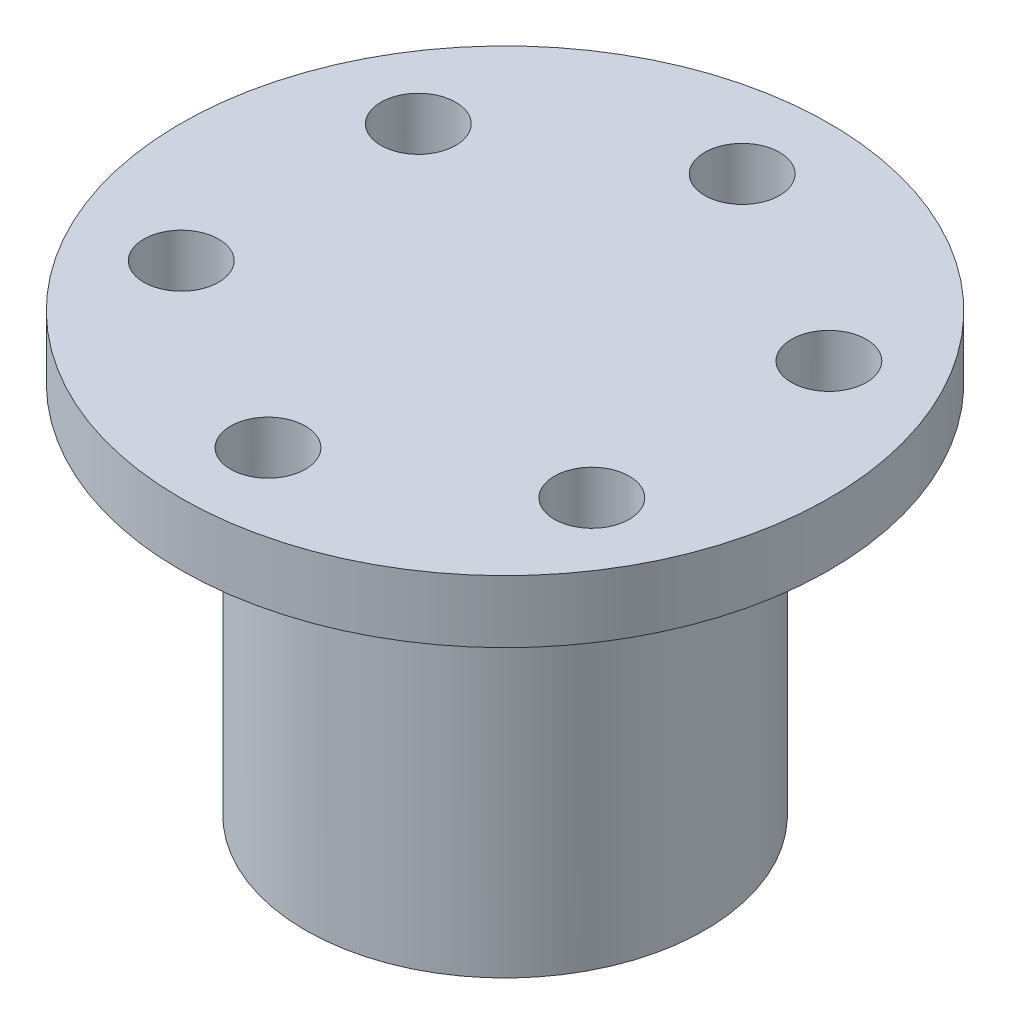
ISO-10303-21;
HEADER;
FILE_DESCRIPTION(('STEP AP214'),'2;1');
FILE_NAME('part.step','',(''),(''),'','','');
FILE_SCHEMA(('AUTOMOTIVE_DESIGN { 1 0 10303 214 1 1 1 1 }'));
ENDSEC;
DATA;
#1=APPLICATION_CONTEXT('core data for automotive mechanical design processes');
#2=APPLICATION_PROTOCOL_DEFINITION('international standard','automotive_design',2000,#1);
#3=PRODUCT_CONTEXT('',#1,'mechanical');
#4=PRODUCT('Part','Part','',(#3));
#5=PRODUCT_RELATED_PRODUCT_CATEGORY('part','',(#4));
#6=PRODUCT_DEFINITION_FORMATION('','',#4);
#7=PRODUCT_DEFINITION_CONTEXT('part definition',#1,'design');
#8=PRODUCT_DEFINITION('design','',#6,#7);
#9=PRODUCT_DEFINITION_SHAPE('','',#8);
#10=(LENGTH_UNIT() NAMED_UNIT(*) SI_UNIT(.MILLI.,.METRE.));
#11=(NAMED_UNIT(*) PLANE_ANGLE_UNIT() SI_UNIT($,.RADIAN.));
#12=(NAMED_UNIT(*) SI_UNIT($,.STERADIAN.) SOLID_ANGLE_UNIT());
#13=UNCERTAINTY_MEASURE_WITH_UNIT(LENGTH_MEASURE(1.E-05),#10,'distance_accuracy_value','');
#14=(GEOMETRIC_REPRESENTATION_CONTEXT(3) GLOBAL_UNCERTAINTY_ASSIGNED_CONTEXT((#13)) GLOBAL_UNIT_ASSIGNED_CONTEXT((#10,
#11,#12)) REPRESENTATION_CONTEXT('',''));
#15=CARTESIAN_POINT('',(0.,0.,0.));
#16=DIRECTION('',(0.,0.,1.));
#17=DIRECTION('',(1.,0.,0.));
#18=AXIS2_PLACEMENT_3D('',#15,#16,#17);
#19=CARTESIAN_POINT('',(0.,5.,0.));
#20=DIRECTION('',(0.,-1.,0.));
#21=DIRECTION('',(0.,0.,-1.));
#22=AXIS2_PLACEMENT_3D('',#19,#20,#21);
#23=CYLINDRICAL_SURFACE('',#22,26.);
#24=CARTESIAN_POINT('',(0.,5.,0.));
#25=DIRECTION('',(0.,1.,0.));
#26=DIRECTION('',(0.,0.,1.));
#27=AXIS2_PLACEMENT_3D('',#24,#25,#26);
#28=CIRCLE('',#27,26.);
#29=CARTESIAN_POINT('',(0.,5.,26.));
#30=VERTEX_POINT('',#29);
#31=EDGE_CURVE('E209',#30,#30,#28,.T.);
#32=ORIENTED_EDGE('',*,*,#31,.F.);
#33=EDGE_LOOP('',(#32));
#34=FACE_BOUND('',#33,.T.);
#35=CARTESIAN_POINT('',(0.,0.,0.));
#36=DIRECTION('',(0.,1.,0.));
#37=DIRECTION('',(0.,0.,1.));
#38=AXIS2_PLACEMENT_3D('',#35,#36,#37);
#39=CIRCLE('',#38,26.);
#40=CARTESIAN_POINT('',(0.,0.,26.));
#41=VERTEX_POINT('',#40);
#42=EDGE_CURVE('E48',#41,#41,#39,.T.);
#43=ORIENTED_EDGE('',*,*,#42,.T.);
#44=EDGE_LOOP('',(#43));
#45=FACE_BOUND('',#44,.T.);
#46=ADVANCED_FACE('F45',(#34,#45),#23,.T.);
#47=CARTESIAN_POINT('',(0.,5.,0.));
#48=DIRECTION('',(0.,1.,0.));
#49=DIRECTION('',(0.,0.,1.));
#50=AXIS2_PLACEMENT_3D('',#47,#48,#49);
#51=PLANE('',#50);
#52=CARTESIAN_POINT('',(1.40512601554121E-12,5.,18.9999999999991));
#53=DIRECTION('',(0.,1.,0.));
#54=DIRECTION('',(0.,0.,1.));
#55=AXIS2_PLACEMENT_3D('',#52,#53,#54);
#56=CIRCLE('',#55,3.);
#57=CARTESIAN_POINT('',(1.40512601554121E-12,5.,21.9999999999991));
#58=VERTEX_POINT('',#57);
#59=EDGE_CURVE('E196',#58,#58,#56,.T.);
#60=ORIENTED_EDGE('',*,*,#59,.F.);
#61=EDGE_LOOP('',(#60));
#62=FACE_BOUND('',#61,.T.);
#63=CARTESIAN_POINT('',(16.4544826719043,5.,9.49999999999828));
#64=DIRECTION('',(0.,1.,0.));
#65=DIRECTION('',(0.,0.,1.));
#66=AXIS2_PLACEMENT_3D('',#63,#64,#65);
#67=CIRCLE('',#66,3.);
#68=CARTESIAN_POINT('',(16.4544826719043,5.,12.4999999999983));
#69=VERTEX_POINT('',#68);
#70=EDGE_CURVE('E188',#69,#69,#67,.T.);
#71=ORIENTED_EDGE('',*,*,#70,.F.);
#72=EDGE_LOOP('',(#71));
#73=FACE_BOUND('',#72,.T.);
#74=CARTESIAN_POINT('',(16.4544826719028,5.,-9.50000000000083));
#75=DIRECTION('',(0.,1.,0.));
#76=DIRECTION('',(0.,0.,1.));
#77=AXIS2_PLACEMENT_3D('',#74,#75,#76);
#78=CIRCLE('',#77,3.);
#79=CARTESIAN_POINT('',(16.4544826719028,5.,-6.50000000000082));
#80=VERTEX_POINT('',#79);
#81=EDGE_CURVE('E180',#80,#80,#78,.T.);
#82=ORIENTED_EDGE('',*,*,#81,.F.);
#83=EDGE_LOOP('',(#82));
#84=FACE_BOUND('',#83,.T.);
#85=CARTESIAN_POINT('',(-1.53523027623947E-12,5.,-18.9999999999991));
#86=DIRECTION('',(0.,1.,0.));
#87=DIRECTION('',(0.,0.,1.));
#88=AXIS2_PLACEMENT_3D('',#85,#86,#87);
#89=CIRCLE('',#88,3.);
#90=CARTESIAN_POINT('',(-1.53523027623947E-12,5.,-15.9999999999991));
#91=VERTEX_POINT('',#90);
#92=EDGE_CURVE('E172',#91,#91,#89,.T.);
#93=ORIENTED_EDGE('',*,*,#92,.F.);
#94=EDGE_LOOP('',(#93));
#95=FACE_BOUND('',#94,.T.);
#96=CARTESIAN_POINT('',(-16.4544826719043,5.,-9.49999999999817));
#97=DIRECTION('',(0.,1.,0.));
#98=DIRECTION('',(0.,0.,1.));
#99=AXIS2_PLACEMENT_3D('',#96,#97,#98);
#100=CIRCLE('',#99,3.);
#101=CARTESIAN_POINT('',(-16.4544826719043,5.,-6.49999999999817));
#102=VERTEX_POINT('',#101);
#103=EDGE_CURVE('E163',#102,#102,#100,.T.);
#104=ORIENTED_EDGE('',*,*,#103,.F.);
#105=EDGE_LOOP('',(#104));
#106=FACE_BOUND('',#105,.T.);
#107=CARTESIAN_POINT('',(-16.4544826719027,5.,9.50000000000094));
#108=DIRECTION('',(0.,1.,0.));
#109=DIRECTION('',(0.,0.,1.));
#110=AXIS2_PLACEMENT_3D('',#107,#108,#109);
#111=CIRCLE('',#110,3.);
#112=CARTESIAN_POINT('',(-16.4544826719027,5.,12.5000000000009));
#113=VERTEX_POINT('',#112);
#114=EDGE_CURVE('E167',#113,#113,#111,.T.);
#115=ORIENTED_EDGE('',*,*,#114,.F.);
#116=EDGE_LOOP('',(#115));
#117=FACE_BOUND('',#116,.T.);
#118=ORIENTED_EDGE('',*,*,#31,.T.);
#119=EDGE_LOOP('',(#118));
#120=FACE_BOUND('',#119,.T.);
#121=ADVANCED_FACE('F224',(#62,#73,#84,#95,#106,#117,#120),#51,.T.);
#122=CARTESIAN_POINT('',(0.,0.,0.));
#123=DIRECTION('',(0.,1.,0.));
#124=DIRECTION('',(0.,0.,1.));
#125=AXIS2_PLACEMENT_3D('',#122,#123,#124);
#126=PLANE('',#125);
#127=CARTESIAN_POINT('',(1.40512601554121E-12,0.,18.9999999999991));
#128=DIRECTION('',(0.,1.,0.));
#129=DIRECTION('',(0.,0.,1.));
#130=AXIS2_PLACEMENT_3D('',#127,#128,#129);
#131=CIRCLE('',#130,3.);
#132=CARTESIAN_POINT('',(1.18326401308734E-12,0.,15.9999999999992));
#133=VERTEX_POINT('',#132);
#134=EDGE_CURVE('E159',#133,#133,#131,.T.);
#135=ORIENTED_EDGE('',*,*,#134,.T.);
#136=CARTESIAN_POINT('',(0.,0.,0.));
#137=DIRECTION('',(0.,1.,0.));
#138=DIRECTION('',(0.,0.,1.));
#139=AXIS2_PLACEMENT_3D('',#136,#137,#138);
#140=CIRCLE('',#139,16.);
#141=CARTESIAN_POINT('',(13.8564064605516,0.,7.99999999999894));
#142=VERTEX_POINT('',#141);
#143=EDGE_CURVE('E56',#133,#142,#140,.T.);
#144=ORIENTED_EDGE('',*,*,#143,.T.);
#145=CARTESIAN_POINT('',(16.4544826719043,0.,9.49999999999828));
#146=DIRECTION('',(0.,1.,0.));
#147=DIRECTION('',(0.,0.,1.));
#148=AXIS2_PLACEMENT_3D('',#145,#146,#147);
#149=CIRCLE('',#148,3.);
#150=EDGE_CURVE('E192',#142,#142,#149,.T.);
#151=ORIENTED_EDGE('',*,*,#150,.T.);
#152=CARTESIAN_POINT('',(13.8564064605504,0.,-8.00000000000108));
#153=VERTEX_POINT('',#152);
#154=EDGE_CURVE('E11',#142,#153,#140,.T.);
#155=ORIENTED_EDGE('',*,*,#154,.T.);
#156=CARTESIAN_POINT('',(16.4544826719028,0.,-9.50000000000083));
#157=DIRECTION('',(0.,1.,0.));
#158=DIRECTION('',(0.,0.,1.));
#159=AXIS2_PLACEMENT_3D('',#156,#157,#158);
#160=CIRCLE('',#159,3.);
#161=EDGE_CURVE('E184',#153,#153,#160,.T.);
#162=ORIENTED_EDGE('',*,*,#161,.T.);
#163=CARTESIAN_POINT('',(-1.29282549578067E-12,0.,-16.));
#164=VERTEX_POINT('',#163);
#165=EDGE_CURVE('E54',#153,#164,#140,.T.);
#166=ORIENTED_EDGE('',*,*,#165,.T.);
#167=CARTESIAN_POINT('',(-1.53523027623947E-12,0.,-18.9999999999991));
#168=DIRECTION('',(0.,1.,0.));
#169=DIRECTION('',(0.,0.,1.));
#170=AXIS2_PLACEMENT_3D('',#167,#168,#169);
#171=CIRCLE('',#170,3.);
#172=EDGE_CURVE('E176',#164,#164,#171,.T.);
#173=ORIENTED_EDGE('',*,*,#172,.T.);
#174=CARTESIAN_POINT('',(-13.8564064605517,0.,-7.99999999999885));
#175=VERTEX_POINT('',#174);
#176=EDGE_CURVE('E431',#164,#175,#140,.T.);
#177=ORIENTED_EDGE('',*,*,#176,.T.);
#178=CARTESIAN_POINT('',(-16.4544826719043,0.,-9.49999999999817));
#179=DIRECTION('',(0.,1.,0.));
#180=DIRECTION('',(0.,0.,1.));
#181=AXIS2_PLACEMENT_3D('',#178,#179,#180);
#182=CIRCLE('',#181,3.);
#183=EDGE_CURVE('E168',#175,#175,#182,.T.);
#184=ORIENTED_EDGE('',*,*,#183,.T.);
#185=CARTESIAN_POINT('',(-13.8564064605503,0.,8.00000000000118));
#186=VERTEX_POINT('',#185);
#187=EDGE_CURVE('E216',#175,#186,#140,.T.);
#188=ORIENTED_EDGE('',*,*,#187,.T.);
#189=CARTESIAN_POINT('',(-16.4544826719027,0.,9.50000000000094));
#190=DIRECTION('',(0.,1.,0.));
#191=DIRECTION('',(0.,0.,1.));
#192=AXIS2_PLACEMENT_3D('',#189,#190,#191);
#193=CIRCLE('',#192,3.);
#194=EDGE_CURVE('E203',#186,#186,#193,.T.);
#195=ORIENTED_EDGE('',*,*,#194,.T.);
#196=EDGE_CURVE('E162',#186,#133,#140,.T.);
#197=ORIENTED_EDGE('',*,*,#196,.T.);
#198=EDGE_LOOP('',(#135,#144,#151,#155,#162,#166,#173,#177,#184,#188,#195,#197));
#199=FACE_BOUND('',#198,.T.);
#200=ORIENTED_EDGE('',*,*,#42,.F.);
#201=EDGE_LOOP('',(#200));
#202=FACE_BOUND('',#201,.T.);
#203=ADVANCED_FACE('F221',(#199,#202),#126,.F.);
#204=CARTESIAN_POINT('',(-16.4544826719027,0.,9.50000000000094));
#205=DIRECTION('',(0.,1.,0.));
#206=DIRECTION('',(0.,0.,1.));
#207=AXIS2_PLACEMENT_3D('',#204,#205,#206);
#208=CYLINDRICAL_SURFACE('',#207,3.);
#209=ORIENTED_EDGE('',*,*,#194,.F.);
#210=EDGE_LOOP('',(#209));
#211=FACE_BOUND('',#210,.T.);
#212=ORIENTED_EDGE('',*,*,#114,.T.);
#213=EDGE_LOOP('',(#212));
#214=FACE_BOUND('',#213,.T.);
#215=ADVANCED_FACE('F223',(#211,#214),#208,.F.);
#216=CARTESIAN_POINT('',(-16.4544826719043,0.,-9.49999999999817));
#217=DIRECTION('',(0.,1.,0.));
#218=DIRECTION('',(0.,0.,1.));
#219=AXIS2_PLACEMENT_3D('',#216,#217,#218);
#220=CYLINDRICAL_SURFACE('',#219,3.);
#221=ORIENTED_EDGE('',*,*,#183,.F.);
#222=EDGE_LOOP('',(#221));
#223=FACE_BOUND('',#222,.T.);
#224=ORIENTED_EDGE('',*,*,#103,.T.);
#225=EDGE_LOOP('',(#224));
#226=FACE_BOUND('',#225,.T.);
#227=ADVANCED_FACE('F230',(#223,#226),#220,.F.);
#228=CARTESIAN_POINT('',(-1.53523027623947E-12,0.,-18.9999999999991));
#229=DIRECTION('',(0.,1.,0.));
#230=DIRECTION('',(0.,0.,1.));
#231=AXIS2_PLACEMENT_3D('',#228,#229,#230);
#232=CYLINDRICAL_SURFACE('',#231,3.);
#233=ORIENTED_EDGE('',*,*,#172,.F.);
#234=EDGE_LOOP('',(#233));
#235=FACE_BOUND('',#234,.T.);
#236=ORIENTED_EDGE('',*,*,#92,.T.);
#237=EDGE_LOOP('',(#236));
#238=FACE_BOUND('',#237,.T.);
#239=ADVANCED_FACE('F265',(#235,#238),#232,.F.);
#240=CARTESIAN_POINT('',(16.4544826719028,0.,-9.50000000000083));
#241=DIRECTION('',(0.,1.,0.));
#242=DIRECTION('',(0.,0.,1.));
#243=AXIS2_PLACEMENT_3D('',#240,#241,#242);
#244=CYLINDRICAL_SURFACE('',#243,3.);
#245=ORIENTED_EDGE('',*,*,#161,.F.);
#246=EDGE_LOOP('',(#245));
#247=FACE_BOUND('',#246,.T.);
#248=ORIENTED_EDGE('',*,*,#81,.T.);
#249=EDGE_LOOP('',(#248));
#250=FACE_BOUND('',#249,.T.);
#251=ADVANCED_FACE('F276',(#247,#250),#244,.F.);
#252=CARTESIAN_POINT('',(16.4544826719043,0.,9.49999999999828));
#253=DIRECTION('',(0.,1.,0.));
#254=DIRECTION('',(0.,0.,1.));
#255=AXIS2_PLACEMENT_3D('',#252,#253,#254);
#256=CYLINDRICAL_SURFACE('',#255,3.);
#257=ORIENTED_EDGE('',*,*,#150,.F.);
#258=EDGE_LOOP('',(#257));
#259=FACE_BOUND('',#258,.T.);
#260=ORIENTED_EDGE('',*,*,#70,.T.);
#261=EDGE_LOOP('',(#260));
#262=FACE_BOUND('',#261,.T.);
#263=ADVANCED_FACE('F287',(#259,#262),#256,.F.);
#264=CARTESIAN_POINT('',(1.40512601554121E-12,0.,18.9999999999991));
#265=DIRECTION('',(0.,1.,0.));
#266=DIRECTION('',(0.,0.,1.));
#267=AXIS2_PLACEMENT_3D('',#264,#265,#266);
#268=CYLINDRICAL_SURFACE('',#267,3.);
#269=ORIENTED_EDGE('',*,*,#134,.F.);
#270=EDGE_LOOP('',(#269));
#271=FACE_BOUND('',#270,.T.);
#272=ORIENTED_EDGE('',*,*,#59,.T.);
#273=EDGE_LOOP('',(#272));
#274=FACE_BOUND('',#273,.T.);
#275=ADVANCED_FACE('F298',(#271,#274),#268,.F.);
#276=CARTESIAN_POINT('',(0.,-30.,0.));
#277=DIRECTION('',(0.,1.,0.));
#278=DIRECTION('',(0.,0.,1.));
#279=AXIS2_PLACEMENT_3D('',#276,#277,#278);
#280=CYLINDRICAL_SURFACE('',#279,16.);
#281=CARTESIAN_POINT('',(0.,-30.,0.));
#282=DIRECTION('',(0.,1.,0.));
#283=DIRECTION('',(0.,0.,1.));
#284=AXIS2_PLACEMENT_3D('',#281,#282,#283);
#285=CIRCLE('',#284,16.);
#286=CARTESIAN_POINT('',(0.,-30.,16.));
#287=VERTEX_POINT('',#286);
#288=EDGE_CURVE('E156',#287,#287,#285,.T.);
#289=ORIENTED_EDGE('',*,*,#288,.T.);
#290=EDGE_LOOP('',(#289));
#291=FACE_BOUND('',#290,.T.);
#292=ORIENTED_EDGE('',*,*,#143,.F.);
#293=ORIENTED_EDGE('',*,*,#196,.F.);
#294=ORIENTED_EDGE('',*,*,#187,.F.);
#295=ORIENTED_EDGE('',*,*,#176,.F.);
#296=ORIENTED_EDGE('',*,*,#165,.F.);
#297=ORIENTED_EDGE('',*,*,#154,.F.);
#298=EDGE_LOOP('',(#292,#293,#294,#295,#296,#297));
#299=FACE_BOUND('',#298,.T.);
#300=ADVANCED_FACE('F309',(#291,#299),#280,.T.);
#301=CARTESIAN_POINT('',(0.,-30.,0.));
#302=DIRECTION('',(0.,1.,0.));
#303=DIRECTION('',(0.,0.,1.));
#304=AXIS2_PLACEMENT_3D('',#301,#302,#303);
#305=PLANE('',#304);
#306=DIRECTION('',(-1.,0.,0.));
#307=VECTOR('',#306,1.);
#308=CARTESIAN_POINT('',(-9.,-30.,9.));
#309=LINE('',#308,#307);
#310=CARTESIAN_POINT('',(9.,-30.,9.));
#311=VERTEX_POINT('',#310);
#312=CARTESIAN_POINT('',(-9.,-30.,9.));
#313=VERTEX_POINT('',#312);
#314=EDGE_CURVE('E142',#311,#313,#309,.T.);
#315=ORIENTED_EDGE('',*,*,#314,.F.);
#316=DIRECTION('',(0.,0.,1.));
#317=VECTOR('',#316,1.);
#318=CARTESIAN_POINT('',(9.,-30.,-9.));
#319=LINE('',#318,#317);
#320=CARTESIAN_POINT('',(9.,-30.,-9.));
#321=VERTEX_POINT('',#320);
#322=EDGE_CURVE('E63',#321,#311,#319,.T.);
#323=ORIENTED_EDGE('',*,*,#322,.F.);
#324=DIRECTION('',(1.,0.,0.));
#325=VECTOR('',#324,1.);
#326=CARTESIAN_POINT('',(-9.,-30.,-9.));
#327=LINE('',#326,#325);
#328=CARTESIAN_POINT('',(-9.,-30.,-9.));
#329=VERTEX_POINT('',#328);
#330=EDGE_CURVE('E129',#329,#321,#327,.T.);
#331=ORIENTED_EDGE('',*,*,#330,.F.);
#332=DIRECTION('',(0.,0.,-1.));
#333=VECTOR('',#332,1.);
#334=CARTESIAN_POINT('',(-9.,-30.,-9.));
#335=LINE('',#334,#333);
#336=EDGE_CURVE('E133',#313,#329,#335,.T.);
#337=ORIENTED_EDGE('',*,*,#336,.F.);
#338=EDGE_LOOP('',(#315,#323,#331,#337));
#339=FACE_BOUND('',#338,.T.);
#340=ORIENTED_EDGE('',*,*,#288,.F.);
#341=EDGE_LOOP('',(#340));
#342=FACE_BOUND('',#341,.T.);
#343=ADVANCED_FACE('F320',(#339,#342),#305,.F.);
#344=CARTESIAN_POINT('',(9.,-5.75,-9.));
#345=DIRECTION('',(1.,0.,0.));
#346=DIRECTION('',(0.,0.,-1.));
#347=AXIS2_PLACEMENT_3D('',#344,#345,#346);
#348=PLANE('',#347);
#349=ORIENTED_EDGE('',*,*,#322,.T.);
#350=DIRECTION('',(0.,-1.,0.));
#351=VECTOR('',#350,1.);
#352=CARTESIAN_POINT('',(9.,-5.75,9.));
#353=LINE('',#352,#351);
#354=CARTESIAN_POINT('',(9.,-5.75,9.));
#355=VERTEX_POINT('',#354);
#356=EDGE_CURVE('E104',#355,#311,#353,.T.);
#357=ORIENTED_EDGE('',*,*,#356,.F.);
#358=DIRECTION('',(0.,0.,1.));
#359=VECTOR('',#358,1.);
#360=CARTESIAN_POINT('',(9.,-5.75,-9.));
#361=LINE('',#360,#359);
#362=CARTESIAN_POINT('',(9.,-5.75,-9.));
#363=VERTEX_POINT('',#362);
#364=EDGE_CURVE('E108',#363,#355,#361,.T.);
#365=ORIENTED_EDGE('',*,*,#364,.F.);
#366=DIRECTION('',(0.,-1.,0.));
#367=VECTOR('',#366,1.);
#368=CARTESIAN_POINT('',(9.,-5.75,-9.));
#369=LINE('',#368,#367);
#370=EDGE_CURVE('E148',#363,#321,#369,.T.);
#371=ORIENTED_EDGE('',*,*,#370,.T.);
#372=EDGE_LOOP('',(#349,#357,#365,#371));
#373=FACE_BOUND('',#372,.T.);
#374=ADVANCED_FACE('F106',(#373),#348,.F.);
#375=CARTESIAN_POINT('',(-9.,-5.75,-9.));
#376=DIRECTION('',(0.,0.,-1.));
#377=DIRECTION('',(-1.,0.,0.));
#378=AXIS2_PLACEMENT_3D('',#375,#376,#377);
#379=PLANE('',#378);
#380=ORIENTED_EDGE('',*,*,#330,.T.);
#381=ORIENTED_EDGE('',*,*,#370,.F.);
#382=DIRECTION('',(1.,0.,0.));
#383=VECTOR('',#382,1.);
#384=CARTESIAN_POINT('',(-9.,-5.75,-9.));
#385=LINE('',#384,#383);
#386=CARTESIAN_POINT('',(-9.,-5.75,-9.));
#387=VERTEX_POINT('',#386);
#388=EDGE_CURVE('E115',#387,#363,#385,.T.);
#389=ORIENTED_EDGE('',*,*,#388,.F.);
#390=DIRECTION('',(0.,-1.,0.));
#391=VECTOR('',#390,1.);
#392=CARTESIAN_POINT('',(-9.,-5.75,-9.));
#393=LINE('',#392,#391);
#394=EDGE_CURVE('E151',#387,#329,#393,.T.);
#395=ORIENTED_EDGE('',*,*,#394,.T.);
#396=EDGE_LOOP('',(#380,#381,#389,#395));
#397=FACE_BOUND('',#396,.T.);
#398=ADVANCED_FACE('F341',(#397),#379,.F.);
#399=CARTESIAN_POINT('',(-9.,-5.75,-9.));
#400=DIRECTION('',(-1.,0.,0.));
#401=DIRECTION('',(0.,0.,1.));
#402=AXIS2_PLACEMENT_3D('',#399,#400,#401);
#403=PLANE('',#402);
#404=ORIENTED_EDGE('',*,*,#336,.T.);
#405=ORIENTED_EDGE('',*,*,#394,.F.);
#406=DIRECTION('',(0.,0.,-1.));
#407=VECTOR('',#406,1.);
#408=CARTESIAN_POINT('',(-9.,-5.75,-9.));
#409=LINE('',#408,#407);
#410=CARTESIAN_POINT('',(-9.,-5.75,9.));
#411=VERTEX_POINT('',#410);
#412=EDGE_CURVE('E124',#411,#387,#409,.T.);
#413=ORIENTED_EDGE('',*,*,#412,.F.);
#414=DIRECTION('',(0.,-1.,0.));
#415=VECTOR('',#414,1.);
#416=CARTESIAN_POINT('',(-9.,-5.75,9.));
#417=LINE('',#416,#415);
#418=EDGE_CURVE('E114',#411,#313,#417,.T.);
#419=ORIENTED_EDGE('',*,*,#418,.T.);
#420=EDGE_LOOP('',(#404,#405,#413,#419));
#421=FACE_BOUND('',#420,.T.);
#422=ADVANCED_FACE('F351',(#421),#403,.F.);
#423=CARTESIAN_POINT('',(-9.,-5.75,9.));
#424=DIRECTION('',(0.,0.,1.));
#425=DIRECTION('',(1.,0.,0.));
#426=AXIS2_PLACEMENT_3D('',#423,#424,#425);
#427=PLANE('',#426);
#428=ORIENTED_EDGE('',*,*,#314,.T.);
#429=ORIENTED_EDGE('',*,*,#418,.F.);
#430=DIRECTION('',(-1.,0.,0.));
#431=VECTOR('',#430,1.);
#432=CARTESIAN_POINT('',(-9.,-5.75,9.));
#433=LINE('',#432,#431);
#434=EDGE_CURVE('E118',#355,#411,#433,.T.);
#435=ORIENTED_EDGE('',*,*,#434,.F.);
#436=ORIENTED_EDGE('',*,*,#356,.T.);
#437=EDGE_LOOP('',(#428,#429,#435,#436));
#438=FACE_BOUND('',#437,.T.);
#439=ADVANCED_FACE('F119',(#438),#427,.F.);
#440=CARTESIAN_POINT('',(0.,-5.75,0.));
#441=DIRECTION('',(0.,1.,0.));
#442=DIRECTION('',(0.,0.,1.));
#443=AXIS2_PLACEMENT_3D('',#440,#441,#442);
#444=PLANE('',#443);
#445=ORIENTED_EDGE('',*,*,#364,.T.);
#446=ORIENTED_EDGE('',*,*,#434,.T.);
#447=ORIENTED_EDGE('',*,*,#412,.T.);
#448=ORIENTED_EDGE('',*,*,#388,.T.);
#449=EDGE_LOOP('',(#445,#446,#447,#448));
#450=FACE_BOUND('',#449,.T.);
#451=ADVANCED_FACE('F126',(#450),#444,.F.);
#452=CLOSED_SHELL('',(#46,#121,#203,#215,#227,#239,#251,#263,#275,#300,#343,#374,#398,#422,#439,#451));
#453=MANIFOLD_SOLID_BREP('B2',#452);
#454=ADVANCED_BREP_SHAPE_REPRESENTATION('',(#18,#453),#14);
#455=SHAPE_DEFINITION_REPRESENTATION(#9,#454);
ENDSEC;
END-ISO-10303-21;
